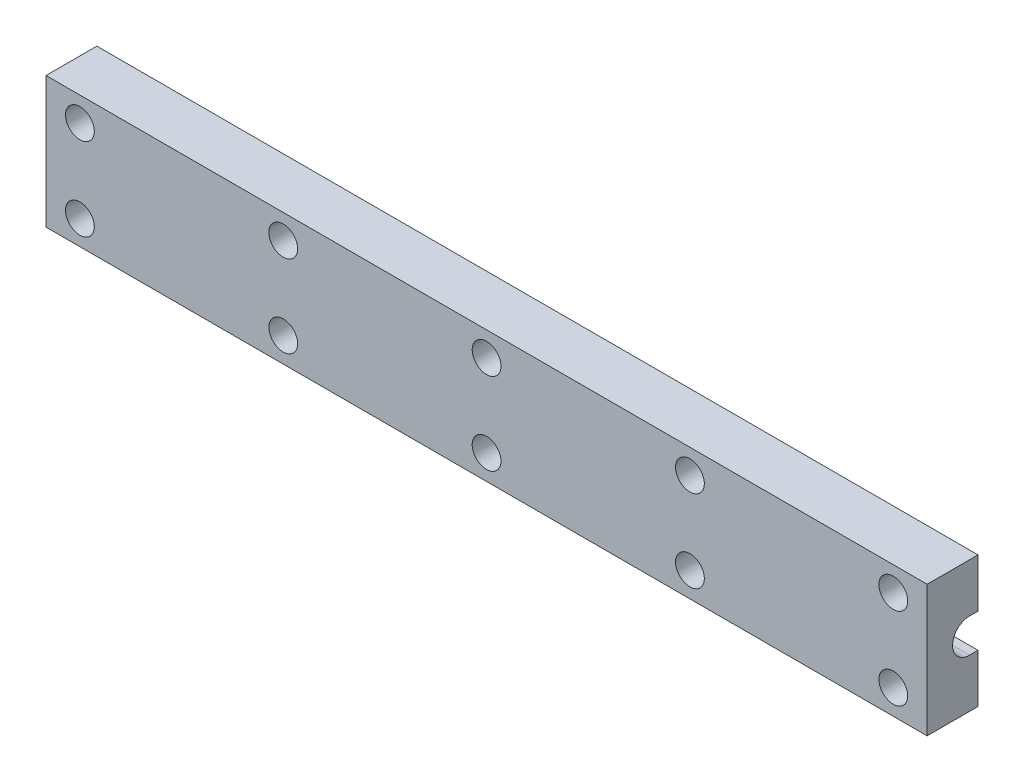
ISO-10303-21;
HEADER;
FILE_DESCRIPTION(('STEP AP214'),'2;1');
FILE_NAME('part.step','',(''),(''),'','','');
FILE_SCHEMA(('AUTOMOTIVE_DESIGN { 1 0 10303 214 1 1 1 1 }'));
ENDSEC;
DATA;
#1=APPLICATION_CONTEXT('core data for automotive mechanical design processes');
#2=APPLICATION_PROTOCOL_DEFINITION('international standard','automotive_design',2000,#1);
#3=PRODUCT_CONTEXT('',#1,'mechanical');
#4=PRODUCT('Part','Part','',(#3));
#5=PRODUCT_RELATED_PRODUCT_CATEGORY('part','',(#4));
#6=PRODUCT_DEFINITION_FORMATION('','',#4);
#7=PRODUCT_DEFINITION_CONTEXT('part definition',#1,'design');
#8=PRODUCT_DEFINITION('design','',#6,#7);
#9=PRODUCT_DEFINITION_SHAPE('','',#8);
#10=(LENGTH_UNIT() NAMED_UNIT(*) SI_UNIT(.MILLI.,.METRE.));
#11=(NAMED_UNIT(*) PLANE_ANGLE_UNIT() SI_UNIT($,.RADIAN.));
#12=(NAMED_UNIT(*) SI_UNIT($,.STERADIAN.) SOLID_ANGLE_UNIT());
#13=UNCERTAINTY_MEASURE_WITH_UNIT(LENGTH_MEASURE(1.E-05),#10,'distance_accuracy_value','');
#14=(GEOMETRIC_REPRESENTATION_CONTEXT(3) GLOBAL_UNCERTAINTY_ASSIGNED_CONTEXT((#13)) GLOBAL_UNIT_ASSIGNED_CONTEXT((#10,
#11,#12)) REPRESENTATION_CONTEXT('',''));
#15=CARTESIAN_POINT('',(0.,0.,0.));
#16=DIRECTION('',(0.,0.,1.));
#17=DIRECTION('',(1.,0.,0.));
#18=AXIS2_PLACEMENT_3D('',#15,#16,#17);
#19=CARTESIAN_POINT('',(250.645147999783,0.,246.970904960978));
#20=DIRECTION('',(0.,0.,1.));
#21=DIRECTION('',(1.,0.,0.));
#22=AXIS2_PLACEMENT_3D('',#19,#20,#21);
#23=PLANE('',#22);
#24=CARTESIAN_POINT('',(150.645147999783,176.538538158487,246.970904960978));
#25=DIRECTION('',(0.,0.,1.));
#26=DIRECTION('',(1.,0.,0.));
#27=AXIS2_PLACEMENT_3D('',#24,#25,#26);
#28=CIRCLE('',#27,1.70000000000001);
#29=CARTESIAN_POINT('',(152.345147999783,176.538538158487,246.970904960978));
#30=VERTEX_POINT('',#29);
#31=EDGE_CURVE('E135',#30,#30,#28,.T.);
#32=ORIENTED_EDGE('',*,*,#31,.F.);
#33=EDGE_LOOP('',(#32));
#34=FACE_BOUND('',#33,.T.);
#35=CARTESIAN_POINT('',(150.645147999783,186.288538158496,246.970904960978));
#36=DIRECTION('',(0.,0.,1.));
#37=DIRECTION('',(1.,0.,0.));
#38=AXIS2_PLACEMENT_3D('',#35,#36,#37);
#39=CIRCLE('',#38,1.70000000000001);
#40=CARTESIAN_POINT('',(152.345147999783,186.288538158496,246.970904960978));
#41=VERTEX_POINT('',#40);
#42=EDGE_CURVE('E130',#41,#41,#39,.T.);
#43=ORIENTED_EDGE('',*,*,#42,.F.);
#44=EDGE_LOOP('',(#43));
#45=FACE_BOUND('',#44,.T.);
#46=CARTESIAN_POINT('',(198.645147999783,186.288538158496,246.970904960978));
#47=DIRECTION('',(0.,0.,1.));
#48=DIRECTION('',(1.,0.,0.));
#49=AXIS2_PLACEMENT_3D('',#46,#47,#48);
#50=CIRCLE('',#49,1.70000000000001);
#51=CARTESIAN_POINT('',(200.345147999783,186.288538158496,246.970904960978));
#52=VERTEX_POINT('',#51);
#53=EDGE_CURVE('E167',#52,#52,#50,.F.);
#54=ORIENTED_EDGE('',*,*,#53,.T.);
#55=EDGE_LOOP('',(#54));
#56=FACE_BOUND('',#55,.T.);
#57=CARTESIAN_POINT('',(222.645147999783,186.288538158496,246.970904960978));
#58=DIRECTION('',(0.,0.,1.));
#59=DIRECTION('',(1.,0.,0.));
#60=AXIS2_PLACEMENT_3D('',#57,#58,#59);
#61=CIRCLE('',#60,1.70000000000001);
#62=CARTESIAN_POINT('',(224.345147999783,186.288538158496,246.970904960978));
#63=VERTEX_POINT('',#62);
#64=EDGE_CURVE('E175',#63,#63,#61,.F.);
#65=ORIENTED_EDGE('',*,*,#64,.T.);
#66=EDGE_LOOP('',(#65));
#67=FACE_BOUND('',#66,.T.);
#68=CARTESIAN_POINT('',(174.645147999783,186.288538158496,246.970904960978));
#69=DIRECTION('',(0.,0.,1.));
#70=DIRECTION('',(1.,0.,0.));
#71=AXIS2_PLACEMENT_3D('',#68,#69,#70);
#72=CIRCLE('',#71,1.70000000000001);
#73=CARTESIAN_POINT('',(176.345147999783,186.288538158496,246.970904960978));
#74=VERTEX_POINT('',#73);
#75=EDGE_CURVE('E162',#74,#74,#72,.F.);
#76=ORIENTED_EDGE('',*,*,#75,.T.);
#77=EDGE_LOOP('',(#76));
#78=FACE_BOUND('',#77,.T.);
#79=CARTESIAN_POINT('',(246.645147999783,186.288538158496,246.970904960978));
#80=DIRECTION('',(0.,0.,1.));
#81=DIRECTION('',(1.,0.,0.));
#82=AXIS2_PLACEMENT_3D('',#79,#80,#81);
#83=CIRCLE('',#82,1.70000000000001);
#84=CARTESIAN_POINT('',(248.345147999783,186.288538158496,246.970904960978));
#85=VERTEX_POINT('',#84);
#86=EDGE_CURVE('E183',#85,#85,#83,.F.);
#87=ORIENTED_EDGE('',*,*,#86,.T.);
#88=EDGE_LOOP('',(#87));
#89=FACE_BOUND('',#88,.T.);
#90=DIRECTION('',(-1.,0.,0.));
#91=VECTOR('',#90,1.);
#92=CARTESIAN_POINT('',(250.645147999783,189.1635381585,246.970904960978));
#93=LINE('',#92,#91);
#94=CARTESIAN_POINT('',(250.645147999783,189.1635381585,246.970904960978));
#95=VERTEX_POINT('',#94);
#96=CARTESIAN_POINT('',(146.645147999783,189.1635381585,246.970904960978));
#97=VERTEX_POINT('',#96);
#98=EDGE_CURVE('E240',#95,#97,#93,.T.);
#99=ORIENTED_EDGE('',*,*,#98,.T.);
#100=DIRECTION('',(0.,1.,0.));
#101=VECTOR('',#100,1.);
#102=CARTESIAN_POINT('',(146.645147999783,173.663538158483,246.970904960978));
#103=LINE('',#102,#101);
#104=CARTESIAN_POINT('',(146.645147999783,173.663538158483,246.970904960978));
#105=VERTEX_POINT('',#104);
#106=EDGE_CURVE('E145',#105,#97,#103,.T.);
#107=ORIENTED_EDGE('',*,*,#106,.F.);
#108=DIRECTION('',(-1.,0.,0.));
#109=VECTOR('',#108,1.);
#110=CARTESIAN_POINT('',(250.645147999783,173.663538158483,246.970904960978));
#111=LINE('',#110,#109);
#112=CARTESIAN_POINT('',(250.645147999783,173.663538158483,246.970904960978));
#113=VERTEX_POINT('',#112);
#114=EDGE_CURVE('E237',#113,#105,#111,.T.);
#115=ORIENTED_EDGE('',*,*,#114,.F.);
#116=DIRECTION('',(0.,1.,0.));
#117=VECTOR('',#116,1.);
#118=CARTESIAN_POINT('',(250.645147999783,0.,246.970904960978));
#119=LINE('',#118,#117);
#120=EDGE_CURVE('E220',#113,#95,#119,.T.);
#121=ORIENTED_EDGE('',*,*,#120,.T.);
#122=EDGE_LOOP('',(#99,#107,#115,#121));
#123=FACE_BOUND('',#122,.T.);
#124=CARTESIAN_POINT('',(198.645147999783,176.593153442371,246.970904960978));
#125=DIRECTION('',(0.,0.,1.));
#126=DIRECTION('',(1.,0.,0.));
#127=AXIS2_PLACEMENT_3D('',#124,#125,#126);
#128=CIRCLE('',#127,1.70000000000001);
#129=CARTESIAN_POINT('',(200.345147999783,176.593153442371,246.970904960978));
#130=VERTEX_POINT('',#129);
#131=EDGE_CURVE('E163',#130,#130,#128,.T.);
#132=ORIENTED_EDGE('',*,*,#131,.F.);
#133=EDGE_LOOP('',(#132));
#134=FACE_BOUND('',#133,.T.);
#135=CARTESIAN_POINT('',(174.645147999783,176.593153442371,246.970904960978));
#136=DIRECTION('',(0.,0.,1.));
#137=DIRECTION('',(1.,0.,0.));
#138=AXIS2_PLACEMENT_3D('',#135,#136,#137);
#139=CIRCLE('',#138,1.70000000000001);
#140=CARTESIAN_POINT('',(176.345147999783,176.593153442371,246.970904960978));
#141=VERTEX_POINT('',#140);
#142=EDGE_CURVE('E158',#141,#141,#139,.T.);
#143=ORIENTED_EDGE('',*,*,#142,.F.);
#144=EDGE_LOOP('',(#143));
#145=FACE_BOUND('',#144,.T.);
#146=CARTESIAN_POINT('',(246.645147999783,176.593153442371,246.970904960978));
#147=DIRECTION('',(0.,0.,1.));
#148=DIRECTION('',(1.,0.,0.));
#149=AXIS2_PLACEMENT_3D('',#146,#147,#148);
#150=CIRCLE('',#149,1.70000000000001);
#151=CARTESIAN_POINT('',(248.345147999783,176.593153442371,246.970904960978));
#152=VERTEX_POINT('',#151);
#153=EDGE_CURVE('E179',#152,#152,#150,.T.);
#154=ORIENTED_EDGE('',*,*,#153,.F.);
#155=EDGE_LOOP('',(#154));
#156=FACE_BOUND('',#155,.T.);
#157=CARTESIAN_POINT('',(222.645147999783,176.593153442371,246.970904960978));
#158=DIRECTION('',(0.,0.,1.));
#159=DIRECTION('',(1.,0.,0.));
#160=AXIS2_PLACEMENT_3D('',#157,#158,#159);
#161=CIRCLE('',#160,1.70000000000001);
#162=CARTESIAN_POINT('',(224.345147999783,176.593153442371,246.970904960978));
#163=VERTEX_POINT('',#162);
#164=EDGE_CURVE('E171',#163,#163,#161,.T.);
#165=ORIENTED_EDGE('',*,*,#164,.F.);
#166=EDGE_LOOP('',(#165));
#167=FACE_BOUND('',#166,.T.);
#168=ADVANCED_FACE('F40',(#34,#45,#56,#67,#78,#89,#123,#134,#145,#156,#167),#23,.T.);
#169=CARTESIAN_POINT('',(250.645147999783,181.413538158492,241.970904960978));
#170=DIRECTION('',(-1.,0.,0.));
#171=DIRECTION('',(0.,0.,1.));
#172=AXIS2_PLACEMENT_3D('',#169,#170,#171);
#173=CYLINDRICAL_SURFACE('',#172,2.);
#174=DIRECTION('',(-1.,0.,0.));
#175=VECTOR('',#174,1.);
#176=CARTESIAN_POINT('',(250.645147999783,179.413538158492,241.970904960978));
#177=LINE('',#176,#175);
#178=CARTESIAN_POINT('',(250.645147999783,179.413538158492,241.970904960978));
#179=VERTEX_POINT('',#178);
#180=CARTESIAN_POINT('',(146.645147999783,179.413538158492,241.970904960978));
#181=VERTEX_POINT('',#180);
#182=EDGE_CURVE('E58',#179,#181,#177,.T.);
#183=ORIENTED_EDGE('',*,*,#182,.T.);
#184=CARTESIAN_POINT('',(146.645147999783,181.413538158492,241.970904960978));
#185=DIRECTION('',(1.,0.,0.));
#186=DIRECTION('',(0.,0.,1.));
#187=AXIS2_PLACEMENT_3D('',#184,#185,#186);
#188=CIRCLE('',#187,2.);
#189=CARTESIAN_POINT('',(146.645147999783,183.413538158492,241.970904960978));
#190=VERTEX_POINT('',#189);
#191=EDGE_CURVE('E109',#190,#181,#188,.T.);
#192=ORIENTED_EDGE('',*,*,#191,.F.);
#193=DIRECTION('',(-1.,0.,0.));
#194=VECTOR('',#193,1.);
#195=CARTESIAN_POINT('',(250.645147999783,183.413538158492,241.970904960978));
#196=LINE('',#195,#194);
#197=CARTESIAN_POINT('',(250.645147999783,183.413538158492,241.970904960978));
#198=VERTEX_POINT('',#197);
#199=EDGE_CURVE('E11',#198,#190,#196,.T.);
#200=ORIENTED_EDGE('',*,*,#199,.F.);
#201=CARTESIAN_POINT('',(250.645147999783,181.413538158492,241.970904960978));
#202=DIRECTION('',(1.,0.,0.));
#203=DIRECTION('',(0.,0.,-1.));
#204=AXIS2_PLACEMENT_3D('',#201,#202,#203);
#205=CIRCLE('',#204,2.);
#206=EDGE_CURVE('E111',#198,#179,#205,.T.);
#207=ORIENTED_EDGE('',*,*,#206,.T.);
#208=EDGE_LOOP('',(#183,#192,#200,#207));
#209=FACE_BOUND('',#208,.T.);
#210=ADVANCED_FACE('F42',(#209),#173,.F.);
#211=CARTESIAN_POINT('',(250.645147999783,183.413538158492,0.));
#212=DIRECTION('',(0.,1.,0.));
#213=DIRECTION('',(0.,0.,1.));
#214=AXIS2_PLACEMENT_3D('',#211,#212,#213);
#215=PLANE('',#214);
#216=ORIENTED_EDGE('',*,*,#199,.T.);
#217=DIRECTION('',(0.,0.,1.));
#218=VECTOR('',#217,1.);
#219=CARTESIAN_POINT('',(146.645147999783,183.413538158492,240.970904960978));
#220=LINE('',#219,#218);
#221=CARTESIAN_POINT('',(146.645147999783,183.413538158492,240.970904960978));
#222=VERTEX_POINT('',#221);
#223=EDGE_CURVE('E128',#222,#190,#220,.T.);
#224=ORIENTED_EDGE('',*,*,#223,.F.);
#225=DIRECTION('',(-1.,0.,0.));
#226=VECTOR('',#225,1.);
#227=CARTESIAN_POINT('',(250.645147999783,183.413538158492,240.970904960978));
#228=LINE('',#227,#226);
#229=CARTESIAN_POINT('',(250.645147999783,183.413538158492,240.970904960978));
#230=VERTEX_POINT('',#229);
#231=EDGE_CURVE('E50',#230,#222,#228,.T.);
#232=ORIENTED_EDGE('',*,*,#231,.F.);
#233=DIRECTION('',(0.,0.,-1.));
#234=VECTOR('',#233,1.);
#235=CARTESIAN_POINT('',(250.645147999783,183.413538158492,0.));
#236=LINE('',#235,#234);
#237=EDGE_CURVE('E209',#198,#230,#236,.T.);
#238=ORIENTED_EDGE('',*,*,#237,.F.);
#239=EDGE_LOOP('',(#216,#224,#232,#238));
#240=FACE_BOUND('',#239,.T.);
#241=ADVANCED_FACE('F296',(#240),#215,.F.);
#242=CARTESIAN_POINT('',(250.645147999783,0.,240.970904960978));
#243=DIRECTION('',(0.,0.,-1.));
#244=DIRECTION('',(-1.,0.,0.));
#245=AXIS2_PLACEMENT_3D('',#242,#243,#244);
#246=PLANE('',#245);
#247=CARTESIAN_POINT('',(150.645147999783,186.288538158496,240.970904960978));
#248=DIRECTION('',(0.,0.,-1.));
#249=DIRECTION('',(-1.,0.,0.));
#250=AXIS2_PLACEMENT_3D('',#247,#248,#249);
#251=CIRCLE('',#250,1.70000000000001);
#252=CARTESIAN_POINT('',(148.945147999783,186.288538158496,240.970904960978));
#253=VERTEX_POINT('',#252);
#254=EDGE_CURVE('E522',#253,#253,#251,.T.);
#255=ORIENTED_EDGE('',*,*,#254,.F.);
#256=EDGE_LOOP('',(#255));
#257=FACE_BOUND('',#256,.T.);
#258=CARTESIAN_POINT('',(198.645147999783,186.288538158496,240.970904960978));
#259=DIRECTION('',(0.,0.,-1.));
#260=DIRECTION('',(-1.,0.,0.));
#261=AXIS2_PLACEMENT_3D('',#258,#259,#260);
#262=CIRCLE('',#261,1.70000000000001);
#263=CARTESIAN_POINT('',(196.945147999783,186.288538158496,240.970904960978));
#264=VERTEX_POINT('',#263);
#265=EDGE_CURVE('E203',#264,#264,#262,.F.);
#266=ORIENTED_EDGE('',*,*,#265,.T.);
#267=EDGE_LOOP('',(#266));
#268=FACE_BOUND('',#267,.T.);
#269=CARTESIAN_POINT('',(222.645147999783,186.288538158496,240.970904960978));
#270=DIRECTION('',(0.,0.,-1.));
#271=DIRECTION('',(-1.,0.,0.));
#272=AXIS2_PLACEMENT_3D('',#269,#270,#271);
#273=CIRCLE('',#272,1.70000000000001);
#274=CARTESIAN_POINT('',(220.945147999783,186.288538158496,240.970904960978));
#275=VERTEX_POINT('',#274);
#276=EDGE_CURVE('E199',#275,#275,#273,.F.);
#277=ORIENTED_EDGE('',*,*,#276,.T.);
#278=EDGE_LOOP('',(#277));
#279=FACE_BOUND('',#278,.T.);
#280=CARTESIAN_POINT('',(174.645147999783,186.288538158496,240.970904960978));
#281=DIRECTION('',(0.,0.,-1.));
#282=DIRECTION('',(-1.,0.,0.));
#283=AXIS2_PLACEMENT_3D('',#280,#281,#282);
#284=CIRCLE('',#283,1.70000000000001);
#285=CARTESIAN_POINT('',(172.945147999783,186.288538158496,240.970904960978));
#286=VERTEX_POINT('',#285);
#287=EDGE_CURVE('E195',#286,#286,#284,.F.);
#288=ORIENTED_EDGE('',*,*,#287,.T.);
#289=EDGE_LOOP('',(#288));
#290=FACE_BOUND('',#289,.T.);
#291=CARTESIAN_POINT('',(246.645147999783,186.288538158496,240.970904960978));
#292=DIRECTION('',(0.,0.,-1.));
#293=DIRECTION('',(-1.,0.,0.));
#294=AXIS2_PLACEMENT_3D('',#291,#292,#293);
#295=CIRCLE('',#294,1.70000000000001);
#296=CARTESIAN_POINT('',(244.945147999783,186.288538158496,240.970904960978));
#297=VERTEX_POINT('',#296);
#298=EDGE_CURVE('E191',#297,#297,#295,.F.);
#299=ORIENTED_EDGE('',*,*,#298,.T.);
#300=EDGE_LOOP('',(#299));
#301=FACE_BOUND('',#300,.T.);
#302=ORIENTED_EDGE('',*,*,#231,.T.);
#303=DIRECTION('',(0.,-1.,0.));
#304=VECTOR('',#303,1.);
#305=CARTESIAN_POINT('',(146.645147999783,189.1635381585,240.970904960978));
#306=LINE('',#305,#304);
#307=CARTESIAN_POINT('',(146.645147999783,189.1635381585,240.970904960978));
#308=VERTEX_POINT('',#307);
#309=EDGE_CURVE('E153',#308,#222,#306,.T.);
#310=ORIENTED_EDGE('',*,*,#309,.F.);
#311=DIRECTION('',(-1.,0.,0.));
#312=VECTOR('',#311,1.);
#313=CARTESIAN_POINT('',(250.645147999783,189.1635381585,240.970904960978));
#314=LINE('',#313,#312);
#315=CARTESIAN_POINT('',(250.645147999783,189.1635381585,240.970904960978));
#316=VERTEX_POINT('',#315);
#317=EDGE_CURVE('E243',#316,#308,#314,.T.);
#318=ORIENTED_EDGE('',*,*,#317,.F.);
#319=DIRECTION('',(0.,-1.,0.));
#320=VECTOR('',#319,1.);
#321=CARTESIAN_POINT('',(250.645147999783,0.,240.970904960978));
#322=LINE('',#321,#320);
#323=EDGE_CURVE('E212',#316,#230,#322,.T.);
#324=ORIENTED_EDGE('',*,*,#323,.T.);
#325=EDGE_LOOP('',(#302,#310,#318,#324));
#326=FACE_BOUND('',#325,.T.);
#327=ADVANCED_FACE('F292',(#257,#268,#279,#290,#301,#326),#246,.T.);
#328=CARTESIAN_POINT('',(250.645147999783,189.1635381585,0.));
#329=DIRECTION('',(0.,1.,0.));
#330=DIRECTION('',(0.,0.,1.));
#331=AXIS2_PLACEMENT_3D('',#328,#329,#330);
#332=PLANE('',#331);
#333=ORIENTED_EDGE('',*,*,#317,.T.);
#334=DIRECTION('',(0.,0.,-1.));
#335=VECTOR('',#334,1.);
#336=CARTESIAN_POINT('',(146.645147999783,189.1635381585,246.970904960978));
#337=LINE('',#336,#335);
#338=EDGE_CURVE('E149',#97,#308,#337,.T.);
#339=ORIENTED_EDGE('',*,*,#338,.F.);
#340=ORIENTED_EDGE('',*,*,#98,.F.);
#341=DIRECTION('',(0.,0.,-1.));
#342=VECTOR('',#341,1.);
#343=CARTESIAN_POINT('',(250.645147999783,189.1635381585,0.));
#344=LINE('',#343,#342);
#345=EDGE_CURVE('E216',#95,#316,#344,.T.);
#346=ORIENTED_EDGE('',*,*,#345,.T.);
#347=EDGE_LOOP('',(#333,#339,#340,#346));
#348=FACE_BOUND('',#347,.T.);
#349=ADVANCED_FACE('F288',(#348),#332,.T.);
#350=CARTESIAN_POINT('',(250.645147999783,173.663538158483,0.));
#351=DIRECTION('',(0.,-1.,0.));
#352=DIRECTION('',(0.,0.,-1.));
#353=AXIS2_PLACEMENT_3D('',#350,#351,#352);
#354=PLANE('',#353);
#355=ORIENTED_EDGE('',*,*,#114,.T.);
#356=DIRECTION('',(0.,0.,1.));
#357=VECTOR('',#356,1.);
#358=CARTESIAN_POINT('',(146.645147999783,173.663538158483,240.970904960978));
#359=LINE('',#358,#357);
#360=CARTESIAN_POINT('',(146.645147999783,173.663538158483,240.970904960978));
#361=VERTEX_POINT('',#360);
#362=EDGE_CURVE('E141',#361,#105,#359,.T.);
#363=ORIENTED_EDGE('',*,*,#362,.F.);
#364=DIRECTION('',(-1.,0.,0.));
#365=VECTOR('',#364,1.);
#366=CARTESIAN_POINT('',(250.645147999783,173.663538158483,240.970904960978));
#367=LINE('',#366,#365);
#368=CARTESIAN_POINT('',(250.645147999783,173.663538158483,240.970904960978));
#369=VERTEX_POINT('',#368);
#370=EDGE_CURVE('E234',#369,#361,#367,.T.);
#371=ORIENTED_EDGE('',*,*,#370,.F.);
#372=DIRECTION('',(0.,0.,1.));
#373=VECTOR('',#372,1.);
#374=CARTESIAN_POINT('',(250.645147999783,173.663538158483,0.));
#375=LINE('',#374,#373);
#376=EDGE_CURVE('E224',#369,#113,#375,.T.);
#377=ORIENTED_EDGE('',*,*,#376,.T.);
#378=EDGE_LOOP('',(#355,#363,#371,#377));
#379=FACE_BOUND('',#378,.T.);
#380=ADVANCED_FACE('F269',(#379),#354,.T.);
#381=CARTESIAN_POINT('',(250.645147999783,0.,240.970904960978));
#382=DIRECTION('',(0.,0.,-1.));
#383=DIRECTION('',(-1.,0.,0.));
#384=AXIS2_PLACEMENT_3D('',#381,#382,#383);
#385=PLANE('',#384);
#386=CARTESIAN_POINT('',(150.645147999783,176.538538158487,240.970904960978));
#387=DIRECTION('',(0.,0.,-1.));
#388=DIRECTION('',(-1.,0.,0.));
#389=AXIS2_PLACEMENT_3D('',#386,#387,#388);
#390=CIRCLE('',#389,1.70000000000001);
#391=CARTESIAN_POINT('',(148.945147999783,176.538538158487,240.970904960978));
#392=VERTEX_POINT('',#391);
#393=EDGE_CURVE('E524',#392,#392,#390,.T.);
#394=ORIENTED_EDGE('',*,*,#393,.F.);
#395=EDGE_LOOP('',(#394));
#396=FACE_BOUND('',#395,.T.);
#397=CARTESIAN_POINT('',(222.645147999783,176.593153442371,240.970904960978));
#398=DIRECTION('',(0.,0.,-1.));
#399=DIRECTION('',(-1.,0.,0.));
#400=AXIS2_PLACEMENT_3D('',#397,#398,#399);
#401=CIRCLE('',#400,1.70000000000001);
#402=CARTESIAN_POINT('',(220.945147999783,176.593153442371,240.970904960978));
#403=VERTEX_POINT('',#402);
#404=EDGE_CURVE('E44',#403,#403,#401,.T.);
#405=ORIENTED_EDGE('',*,*,#404,.F.);
#406=EDGE_LOOP('',(#405));
#407=FACE_BOUND('',#406,.T.);
#408=CARTESIAN_POINT('',(246.645147999783,176.593153442371,240.970904960978));
#409=DIRECTION('',(0.,0.,-1.));
#410=DIRECTION('',(-1.,0.,0.));
#411=AXIS2_PLACEMENT_3D('',#408,#409,#410);
#412=CIRCLE('',#411,1.70000000000001);
#413=CARTESIAN_POINT('',(244.945147999783,176.593153442371,240.970904960978));
#414=VERTEX_POINT('',#413);
#415=EDGE_CURVE('E254',#414,#414,#412,.T.);
#416=ORIENTED_EDGE('',*,*,#415,.F.);
#417=EDGE_LOOP('',(#416));
#418=FACE_BOUND('',#417,.T.);
#419=CARTESIAN_POINT('',(174.645147999783,176.593153442371,240.970904960978));
#420=DIRECTION('',(0.,0.,-1.));
#421=DIRECTION('',(-1.,0.,0.));
#422=AXIS2_PLACEMENT_3D('',#419,#420,#421);
#423=CIRCLE('',#422,1.70000000000001);
#424=CARTESIAN_POINT('',(172.945147999783,176.593153442371,240.970904960978));
#425=VERTEX_POINT('',#424);
#426=EDGE_CURVE('E251',#425,#425,#423,.T.);
#427=ORIENTED_EDGE('',*,*,#426,.F.);
#428=EDGE_LOOP('',(#427));
#429=FACE_BOUND('',#428,.T.);
#430=CARTESIAN_POINT('',(198.645147999783,176.593153442371,240.970904960978));
#431=DIRECTION('',(0.,0.,-1.));
#432=DIRECTION('',(-1.,0.,0.));
#433=AXIS2_PLACEMENT_3D('',#430,#431,#432);
#434=CIRCLE('',#433,1.70000000000001);
#435=CARTESIAN_POINT('',(196.945147999783,176.593153442371,240.970904960978));
#436=VERTEX_POINT('',#435);
#437=EDGE_CURVE('E190',#436,#436,#434,.T.);
#438=ORIENTED_EDGE('',*,*,#437,.F.);
#439=EDGE_LOOP('',(#438));
#440=FACE_BOUND('',#439,.T.);
#441=ORIENTED_EDGE('',*,*,#370,.T.);
#442=DIRECTION('',(0.,-1.,0.));
#443=VECTOR('',#442,1.);
#444=CARTESIAN_POINT('',(146.645147999783,179.413538158492,240.970904960978));
#445=LINE('',#444,#443);
#446=CARTESIAN_POINT('',(146.645147999783,179.413538158492,240.970904960978));
#447=VERTEX_POINT('',#446);
#448=EDGE_CURVE('E122',#447,#361,#445,.T.);
#449=ORIENTED_EDGE('',*,*,#448,.F.);
#450=DIRECTION('',(-1.,0.,0.));
#451=VECTOR('',#450,1.);
#452=CARTESIAN_POINT('',(250.645147999783,179.413538158492,240.970904960978));
#453=LINE('',#452,#451);
#454=CARTESIAN_POINT('',(250.645147999783,179.413538158492,240.970904960978));
#455=VERTEX_POINT('',#454);
#456=EDGE_CURVE('E66',#455,#447,#453,.T.);
#457=ORIENTED_EDGE('',*,*,#456,.F.);
#458=DIRECTION('',(0.,-1.,0.));
#459=VECTOR('',#458,1.);
#460=CARTESIAN_POINT('',(250.645147999783,0.,240.970904960978));
#461=LINE('',#460,#459);
#462=EDGE_CURVE('E227',#455,#369,#461,.T.);
#463=ORIENTED_EDGE('',*,*,#462,.T.);
#464=EDGE_LOOP('',(#441,#449,#457,#463));
#465=FACE_BOUND('',#464,.T.);
#466=ADVANCED_FACE('F266',(#396,#407,#418,#429,#440,#465),#385,.T.);
#467=CARTESIAN_POINT('',(250.645147999783,179.413538158492,0.));
#468=DIRECTION('',(0.,1.,0.));
#469=DIRECTION('',(0.,0.,1.));
#470=AXIS2_PLACEMENT_3D('',#467,#468,#469);
#471=PLANE('',#470);
#472=ORIENTED_EDGE('',*,*,#456,.T.);
#473=DIRECTION('',(0.,0.,-1.));
#474=VECTOR('',#473,1.);
#475=CARTESIAN_POINT('',(146.645147999783,179.413538158492,241.970904960978));
#476=LINE('',#475,#474);
#477=EDGE_CURVE('E117',#181,#447,#476,.T.);
#478=ORIENTED_EDGE('',*,*,#477,.F.);
#479=ORIENTED_EDGE('',*,*,#182,.F.);
#480=DIRECTION('',(0.,0.,-1.));
#481=VECTOR('',#480,1.);
#482=CARTESIAN_POINT('',(250.645147999783,179.413538158492,0.));
#483=LINE('',#482,#481);
#484=EDGE_CURVE('E114',#179,#455,#483,.T.);
#485=ORIENTED_EDGE('',*,*,#484,.T.);
#486=EDGE_LOOP('',(#472,#478,#479,#485));
#487=FACE_BOUND('',#486,.T.);
#488=ADVANCED_FACE('F118',(#487),#471,.T.);
#489=CARTESIAN_POINT('',(250.645147999783,0.,0.));
#490=DIRECTION('',(1.,0.,0.));
#491=DIRECTION('',(0.,0.,-1.));
#492=AXIS2_PLACEMENT_3D('',#489,#490,#491);
#493=PLANE('',#492);
#494=ORIENTED_EDGE('',*,*,#206,.F.);
#495=ORIENTED_EDGE('',*,*,#237,.T.);
#496=ORIENTED_EDGE('',*,*,#323,.F.);
#497=ORIENTED_EDGE('',*,*,#345,.F.);
#498=ORIENTED_EDGE('',*,*,#120,.F.);
#499=ORIENTED_EDGE('',*,*,#376,.F.);
#500=ORIENTED_EDGE('',*,*,#462,.F.);
#501=ORIENTED_EDGE('',*,*,#484,.F.);
#502=EDGE_LOOP('',(#494,#495,#496,#497,#498,#499,#500,#501));
#503=FACE_BOUND('',#502,.T.);
#504=ADVANCED_FACE('F285',(#503),#493,.T.);
#505=CARTESIAN_POINT('',(198.645147999783,176.593153442371,236.970904960978));
#506=DIRECTION('',(0.,0.,1.));
#507=DIRECTION('',(1.,0.,0.));
#508=AXIS2_PLACEMENT_3D('',#505,#506,#507);
#509=CYLINDRICAL_SURFACE('',#508,1.70000000000001);
#510=ORIENTED_EDGE('',*,*,#437,.T.);
#511=EDGE_LOOP('',(#510));
#512=FACE_BOUND('',#511,.T.);
#513=ORIENTED_EDGE('',*,*,#131,.T.);
#514=EDGE_LOOP('',(#513));
#515=FACE_BOUND('',#514,.T.);
#516=ADVANCED_FACE('F332',(#512,#515),#509,.F.);
#517=CARTESIAN_POINT('',(174.645147999783,176.593153442371,236.970904960978));
#518=DIRECTION('',(0.,0.,1.));
#519=DIRECTION('',(1.,0.,0.));
#520=AXIS2_PLACEMENT_3D('',#517,#518,#519);
#521=CYLINDRICAL_SURFACE('',#520,1.70000000000001);
#522=ORIENTED_EDGE('',*,*,#426,.T.);
#523=EDGE_LOOP('',(#522));
#524=FACE_BOUND('',#523,.T.);
#525=ORIENTED_EDGE('',*,*,#142,.T.);
#526=EDGE_LOOP('',(#525));
#527=FACE_BOUND('',#526,.T.);
#528=ADVANCED_FACE('F338',(#524,#527),#521,.F.);
#529=CARTESIAN_POINT('',(246.645147999783,176.593153442371,236.970904960978));
#530=DIRECTION('',(0.,0.,1.));
#531=DIRECTION('',(1.,0.,0.));
#532=AXIS2_PLACEMENT_3D('',#529,#530,#531);
#533=CYLINDRICAL_SURFACE('',#532,1.70000000000001);
#534=ORIENTED_EDGE('',*,*,#415,.T.);
#535=EDGE_LOOP('',(#534));
#536=FACE_BOUND('',#535,.T.);
#537=ORIENTED_EDGE('',*,*,#153,.T.);
#538=EDGE_LOOP('',(#537));
#539=FACE_BOUND('',#538,.T.);
#540=ADVANCED_FACE('F345',(#536,#539),#533,.F.);
#541=CARTESIAN_POINT('',(222.645147999783,176.593153442371,236.970904960978));
#542=DIRECTION('',(0.,0.,1.));
#543=DIRECTION('',(1.,0.,0.));
#544=AXIS2_PLACEMENT_3D('',#541,#542,#543);
#545=CYLINDRICAL_SURFACE('',#544,1.70000000000001);
#546=ORIENTED_EDGE('',*,*,#404,.T.);
#547=EDGE_LOOP('',(#546));
#548=FACE_BOUND('',#547,.T.);
#549=ORIENTED_EDGE('',*,*,#164,.T.);
#550=EDGE_LOOP('',(#549));
#551=FACE_BOUND('',#550,.T.);
#552=ADVANCED_FACE('F263',(#548,#551),#545,.F.);
#553=CARTESIAN_POINT('',(246.645147999783,186.288538158496,236.970904960978));
#554=DIRECTION('',(0.,0.,1.));
#555=DIRECTION('',(1.,0.,0.));
#556=AXIS2_PLACEMENT_3D('',#553,#554,#555);
#557=CYLINDRICAL_SURFACE('',#556,1.70000000000001);
#558=ORIENTED_EDGE('',*,*,#298,.F.);
#559=EDGE_LOOP('',(#558));
#560=FACE_BOUND('',#559,.T.);
#561=ORIENTED_EDGE('',*,*,#86,.F.);
#562=EDGE_LOOP('',(#561));
#563=FACE_BOUND('',#562,.T.);
#564=ADVANCED_FACE('F357',(#560,#563),#557,.F.);
#565=CARTESIAN_POINT('',(174.645147999783,186.288538158496,236.970904960978));
#566=DIRECTION('',(0.,0.,1.));
#567=DIRECTION('',(1.,0.,0.));
#568=AXIS2_PLACEMENT_3D('',#565,#566,#567);
#569=CYLINDRICAL_SURFACE('',#568,1.70000000000001);
#570=ORIENTED_EDGE('',*,*,#287,.F.);
#571=EDGE_LOOP('',(#570));
#572=FACE_BOUND('',#571,.T.);
#573=ORIENTED_EDGE('',*,*,#75,.F.);
#574=EDGE_LOOP('',(#573));
#575=FACE_BOUND('',#574,.T.);
#576=ADVANCED_FACE('F363',(#572,#575),#569,.F.);
#577=CARTESIAN_POINT('',(222.645147999783,186.288538158496,236.970904960978));
#578=DIRECTION('',(0.,0.,1.));
#579=DIRECTION('',(1.,0.,0.));
#580=AXIS2_PLACEMENT_3D('',#577,#578,#579);
#581=CYLINDRICAL_SURFACE('',#580,1.70000000000001);
#582=ORIENTED_EDGE('',*,*,#276,.F.);
#583=EDGE_LOOP('',(#582));
#584=FACE_BOUND('',#583,.T.);
#585=ORIENTED_EDGE('',*,*,#64,.F.);
#586=EDGE_LOOP('',(#585));
#587=FACE_BOUND('',#586,.T.);
#588=ADVANCED_FACE('F370',(#584,#587),#581,.F.);
#589=CARTESIAN_POINT('',(198.645147999783,186.288538158496,236.970904960978));
#590=DIRECTION('',(0.,0.,1.));
#591=DIRECTION('',(1.,0.,0.));
#592=AXIS2_PLACEMENT_3D('',#589,#590,#591);
#593=CYLINDRICAL_SURFACE('',#592,1.70000000000001);
#594=ORIENTED_EDGE('',*,*,#265,.F.);
#595=EDGE_LOOP('',(#594));
#596=FACE_BOUND('',#595,.T.);
#597=ORIENTED_EDGE('',*,*,#53,.F.);
#598=EDGE_LOOP('',(#597));
#599=FACE_BOUND('',#598,.T.);
#600=ADVANCED_FACE('F377',(#596,#599),#593,.F.);
#601=CARTESIAN_POINT('',(146.645147999783,181.413538158492,241.970904960978));
#602=DIRECTION('',(-1.,0.,0.));
#603=DIRECTION('',(0.,0.,1.));
#604=AXIS2_PLACEMENT_3D('',#601,#602,#603);
#605=PLANE('',#604);
#606=ORIENTED_EDGE('',*,*,#191,.T.);
#607=ORIENTED_EDGE('',*,*,#477,.T.);
#608=ORIENTED_EDGE('',*,*,#448,.T.);
#609=ORIENTED_EDGE('',*,*,#362,.T.);
#610=ORIENTED_EDGE('',*,*,#106,.T.);
#611=ORIENTED_EDGE('',*,*,#338,.T.);
#612=ORIENTED_EDGE('',*,*,#309,.T.);
#613=ORIENTED_EDGE('',*,*,#223,.T.);
#614=EDGE_LOOP('',(#606,#607,#608,#609,#610,#611,#612,#613));
#615=FACE_BOUND('',#614,.T.);
#616=ADVANCED_FACE('F125',(#615),#605,.T.);
#617=CARTESIAN_POINT('',(150.645147999783,176.538538158487,250.970904960978));
#618=DIRECTION('',(0.,0.,-1.));
#619=DIRECTION('',(-1.,0.,0.));
#620=AXIS2_PLACEMENT_3D('',#617,#618,#619);
#621=CYLINDRICAL_SURFACE('',#620,1.70000000000001);
#622=ORIENTED_EDGE('',*,*,#31,.T.);
#623=EDGE_LOOP('',(#622));
#624=FACE_BOUND('',#623,.T.);
#625=ORIENTED_EDGE('',*,*,#393,.T.);
#626=EDGE_LOOP('',(#625));
#627=FACE_BOUND('',#626,.T.);
#628=ADVANCED_FACE('F390',(#624,#627),#621,.F.);
#629=CARTESIAN_POINT('',(150.645147999783,186.288538158496,250.970904960978));
#630=DIRECTION('',(0.,0.,-1.));
#631=DIRECTION('',(-1.,0.,0.));
#632=AXIS2_PLACEMENT_3D('',#629,#630,#631);
#633=CYLINDRICAL_SURFACE('',#632,1.70000000000001);
#634=ORIENTED_EDGE('',*,*,#42,.T.);
#635=EDGE_LOOP('',(#634));
#636=FACE_BOUND('',#635,.T.);
#637=ORIENTED_EDGE('',*,*,#254,.T.);
#638=EDGE_LOOP('',(#637));
#639=FACE_BOUND('',#638,.T.);
#640=ADVANCED_FACE('F396',(#636,#639),#633,.F.);
#641=CLOSED_SHELL('',(#168,#210,#241,#327,#349,#380,#466,#488,#504,#516,#528,#540,#552,#564,
#576,#588,#600,#616,#628,#640));
#642=MANIFOLD_SOLID_BREP('B2',#641);
#643=ADVANCED_BREP_SHAPE_REPRESENTATION('',(#18,#642),#14);
#644=SHAPE_DEFINITION_REPRESENTATION(#9,#643);
ENDSEC;
END-ISO-10303-21;
